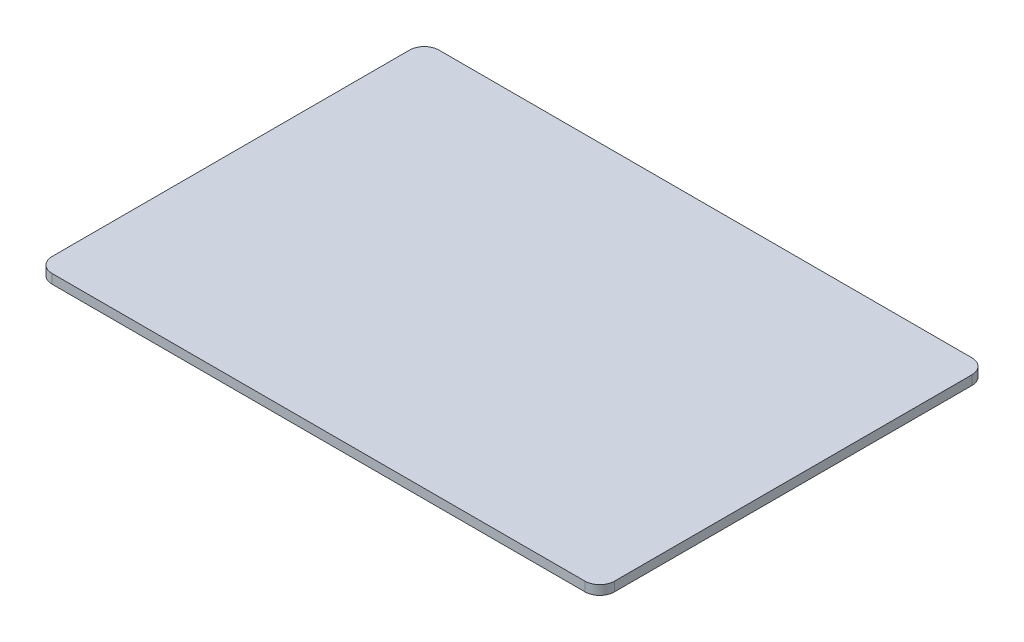
ISO-10303-21;
HEADER;
FILE_DESCRIPTION(('STEP AP214'),'2;1');
FILE_NAME('part.step','',(''),(''),'','','');
FILE_SCHEMA(('AUTOMOTIVE_DESIGN { 1 0 10303 214 1 1 1 1 }'));
ENDSEC;
DATA;
#1=APPLICATION_CONTEXT('core data for automotive mechanical design processes');
#2=APPLICATION_PROTOCOL_DEFINITION('international standard','automotive_design',2000,#1);
#3=PRODUCT_CONTEXT('',#1,'mechanical');
#4=PRODUCT('Part','Part','',(#3));
#5=PRODUCT_RELATED_PRODUCT_CATEGORY('part','',(#4));
#6=PRODUCT_DEFINITION_FORMATION('','',#4);
#7=PRODUCT_DEFINITION_CONTEXT('part definition',#1,'design');
#8=PRODUCT_DEFINITION('design','',#6,#7);
#9=PRODUCT_DEFINITION_SHAPE('','',#8);
#10=(LENGTH_UNIT() NAMED_UNIT(*) SI_UNIT(.MILLI.,.METRE.));
#11=(NAMED_UNIT(*) PLANE_ANGLE_UNIT() SI_UNIT($,.RADIAN.));
#12=(NAMED_UNIT(*) SI_UNIT($,.STERADIAN.) SOLID_ANGLE_UNIT());
#13=UNCERTAINTY_MEASURE_WITH_UNIT(LENGTH_MEASURE(1.E-05),#10,'distance_accuracy_value','');
#14=(GEOMETRIC_REPRESENTATION_CONTEXT(3) GLOBAL_UNCERTAINTY_ASSIGNED_CONTEXT((#13)) GLOBAL_UNIT_ASSIGNED_CONTEXT((#10,
#11,#12)) REPRESENTATION_CONTEXT('',''));
#15=CARTESIAN_POINT('',(0.,0.,0.));
#16=DIRECTION('',(0.,0.,1.));
#17=DIRECTION('',(1.,0.,0.));
#18=AXIS2_PLACEMENT_3D('',#15,#16,#17);
#19=CARTESIAN_POINT('',(-181.65,6.35,-121.85));
#20=DIRECTION('',(0.,-1.,0.));
#21=DIRECTION('',(0.,0.,-1.));
#22=AXIS2_PLACEMENT_3D('',#19,#20,#21);
#23=CYLINDRICAL_SURFACE('',#22,9.99999999999999);
#24=CARTESIAN_POINT('',(-181.65,0.,-121.85));
#25=DIRECTION('',(0.,1.,0.));
#26=DIRECTION('',(0.,0.,-1.));
#27=AXIS2_PLACEMENT_3D('',#24,#25,#26);
#28=CIRCLE('',#27,9.99999999999999);
#29=CARTESIAN_POINT('',(-181.65,0.,-131.85));
#30=VERTEX_POINT('',#29);
#31=CARTESIAN_POINT('',(-191.65,0.,-121.85));
#32=VERTEX_POINT('',#31);
#33=EDGE_CURVE('E129',#30,#32,#28,.T.);
#34=ORIENTED_EDGE('',*,*,#33,.T.);
#35=DIRECTION('',(0.,-1.,0.));
#36=VECTOR('',#35,1.);
#37=CARTESIAN_POINT('',(-191.65,6.35,-121.85));
#38=LINE('',#37,#36);
#39=CARTESIAN_POINT('',(-191.65,6.35,-121.85));
#40=VERTEX_POINT('',#39);
#41=EDGE_CURVE('E11',#40,#32,#38,.T.);
#42=ORIENTED_EDGE('',*,*,#41,.F.);
#43=CARTESIAN_POINT('',(-181.65,6.35,-121.85));
#44=DIRECTION('',(0.,1.,0.));
#45=DIRECTION('',(0.,0.,-1.));
#46=AXIS2_PLACEMENT_3D('',#43,#44,#45);
#47=CIRCLE('',#46,9.99999999999999);
#48=CARTESIAN_POINT('',(-181.65,6.35,-131.85));
#49=VERTEX_POINT('',#48);
#50=EDGE_CURVE('E143',#49,#40,#47,.T.);
#51=ORIENTED_EDGE('',*,*,#50,.F.);
#52=DIRECTION('',(0.,-1.,0.));
#53=VECTOR('',#52,1.);
#54=CARTESIAN_POINT('',(-181.65,6.35,-131.85));
#55=LINE('',#54,#53);
#56=EDGE_CURVE('E125',#49,#30,#55,.T.);
#57=ORIENTED_EDGE('',*,*,#56,.T.);
#58=EDGE_LOOP('',(#34,#42,#51,#57));
#59=FACE_BOUND('',#58,.T.);
#60=ADVANCED_FACE('F33',(#59),#23,.T.);
#61=CARTESIAN_POINT('',(-191.65,6.35,121.85));
#62=DIRECTION('',(1.,0.,0.));
#63=DIRECTION('',(0.,0.,-1.));
#64=AXIS2_PLACEMENT_3D('',#61,#62,#63);
#65=PLANE('',#64);
#66=DIRECTION('',(0.,0.,1.));
#67=VECTOR('',#66,1.);
#68=CARTESIAN_POINT('',(-191.65,0.,121.85));
#69=LINE('',#68,#67);
#70=CARTESIAN_POINT('',(-191.65,0.,121.85));
#71=VERTEX_POINT('',#70);
#72=EDGE_CURVE('E132',#32,#71,#69,.T.);
#73=ORIENTED_EDGE('',*,*,#72,.T.);
#74=DIRECTION('',(0.,-1.,0.));
#75=VECTOR('',#74,1.);
#76=CARTESIAN_POINT('',(-191.65,6.35,121.85));
#77=LINE('',#76,#75);
#78=CARTESIAN_POINT('',(-191.65,6.35,121.85));
#79=VERTEX_POINT('',#78);
#80=EDGE_CURVE('E41',#79,#71,#77,.T.);
#81=ORIENTED_EDGE('',*,*,#80,.F.);
#82=DIRECTION('',(0.,0.,1.));
#83=VECTOR('',#82,1.);
#84=CARTESIAN_POINT('',(-191.65,6.35,121.85));
#85=LINE('',#84,#83);
#86=EDGE_CURVE('E92',#40,#79,#85,.T.);
#87=ORIENTED_EDGE('',*,*,#86,.F.);
#88=ORIENTED_EDGE('',*,*,#41,.T.);
#89=EDGE_LOOP('',(#73,#81,#87,#88));
#90=FACE_BOUND('',#89,.T.);
#91=ADVANCED_FACE('F178',(#90),#65,.F.);
#92=CARTESIAN_POINT('',(-181.65,6.35,121.85));
#93=DIRECTION('',(0.,-1.,0.));
#94=DIRECTION('',(0.,0.,-1.));
#95=AXIS2_PLACEMENT_3D('',#92,#93,#94);
#96=CYLINDRICAL_SURFACE('',#95,10.);
#97=CARTESIAN_POINT('',(-181.65,0.,121.85));
#98=DIRECTION('',(0.,1.,0.));
#99=DIRECTION('',(0.,0.,-1.));
#100=AXIS2_PLACEMENT_3D('',#97,#98,#99);
#101=CIRCLE('',#100,10.);
#102=CARTESIAN_POINT('',(-181.65,0.,131.85));
#103=VERTEX_POINT('',#102);
#104=EDGE_CURVE('E134',#71,#103,#101,.T.);
#105=ORIENTED_EDGE('',*,*,#104,.T.);
#106=DIRECTION('',(0.,-1.,0.));
#107=VECTOR('',#106,1.);
#108=CARTESIAN_POINT('',(-181.65,6.35,131.85));
#109=LINE('',#108,#107);
#110=CARTESIAN_POINT('',(-181.65,6.35,131.85));
#111=VERTEX_POINT('',#110);
#112=EDGE_CURVE('E150',#111,#103,#109,.T.);
#113=ORIENTED_EDGE('',*,*,#112,.F.);
#114=CARTESIAN_POINT('',(-181.65,6.35,121.85));
#115=DIRECTION('',(0.,1.,0.));
#116=DIRECTION('',(0.,0.,-1.));
#117=AXIS2_PLACEMENT_3D('',#114,#115,#116);
#118=CIRCLE('',#117,10.);
#119=EDGE_CURVE('E158',#79,#111,#118,.T.);
#120=ORIENTED_EDGE('',*,*,#119,.F.);
#121=ORIENTED_EDGE('',*,*,#80,.T.);
#122=EDGE_LOOP('',(#105,#113,#120,#121));
#123=FACE_BOUND('',#122,.T.);
#124=ADVANCED_FACE('F156',(#123),#96,.T.);
#125=CARTESIAN_POINT('',(-181.65,6.35,131.85));
#126=DIRECTION('',(0.,0.,-1.));
#127=DIRECTION('',(-1.,0.,0.));
#128=AXIS2_PLACEMENT_3D('',#125,#126,#127);
#129=PLANE('',#128);
#130=DIRECTION('',(1.,0.,0.));
#131=VECTOR('',#130,1.);
#132=CARTESIAN_POINT('',(-181.65,0.,131.85));
#133=LINE('',#132,#131);
#134=CARTESIAN_POINT('',(181.65,0.,131.85));
#135=VERTEX_POINT('',#134);
#136=EDGE_CURVE('E136',#103,#135,#133,.T.);
#137=ORIENTED_EDGE('',*,*,#136,.T.);
#138=DIRECTION('',(0.,-1.,0.));
#139=VECTOR('',#138,1.);
#140=CARTESIAN_POINT('',(181.65,6.35,131.85));
#141=LINE('',#140,#139);
#142=CARTESIAN_POINT('',(181.65,6.35,131.85));
#143=VERTEX_POINT('',#142);
#144=EDGE_CURVE('E147',#143,#135,#141,.T.);
#145=ORIENTED_EDGE('',*,*,#144,.F.);
#146=DIRECTION('',(1.,0.,0.));
#147=VECTOR('',#146,1.);
#148=CARTESIAN_POINT('',(-181.65,6.35,131.85));
#149=LINE('',#148,#147);
#150=EDGE_CURVE('E170',#111,#143,#149,.T.);
#151=ORIENTED_EDGE('',*,*,#150,.F.);
#152=ORIENTED_EDGE('',*,*,#112,.T.);
#153=EDGE_LOOP('',(#137,#145,#151,#152));
#154=FACE_BOUND('',#153,.T.);
#155=ADVANCED_FACE('F166',(#154),#129,.F.);
#156=CARTESIAN_POINT('',(181.65,6.35,121.85));
#157=DIRECTION('',(0.,-1.,0.));
#158=DIRECTION('',(0.,0.,-1.));
#159=AXIS2_PLACEMENT_3D('',#156,#157,#158);
#160=CYLINDRICAL_SURFACE('',#159,10.);
#161=CARTESIAN_POINT('',(181.65,0.,121.85));
#162=DIRECTION('',(0.,1.,0.));
#163=DIRECTION('',(0.,0.,-1.));
#164=AXIS2_PLACEMENT_3D('',#161,#162,#163);
#165=CIRCLE('',#164,10.);
#166=CARTESIAN_POINT('',(191.65,0.,121.85));
#167=VERTEX_POINT('',#166);
#168=EDGE_CURVE('E138',#135,#167,#165,.T.);
#169=ORIENTED_EDGE('',*,*,#168,.T.);
#170=DIRECTION('',(0.,-1.,0.));
#171=VECTOR('',#170,1.);
#172=CARTESIAN_POINT('',(191.65,6.35,121.85));
#173=LINE('',#172,#171);
#174=CARTESIAN_POINT('',(191.65,6.35,121.85));
#175=VERTEX_POINT('',#174);
#176=EDGE_CURVE('E120',#175,#167,#173,.T.);
#177=ORIENTED_EDGE('',*,*,#176,.F.);
#178=CARTESIAN_POINT('',(181.65,6.35,121.85));
#179=DIRECTION('',(0.,1.,0.));
#180=DIRECTION('',(0.,0.,-1.));
#181=AXIS2_PLACEMENT_3D('',#178,#179,#180);
#182=CIRCLE('',#181,10.);
#183=EDGE_CURVE('E111',#143,#175,#182,.T.);
#184=ORIENTED_EDGE('',*,*,#183,.F.);
#185=ORIENTED_EDGE('',*,*,#144,.T.);
#186=EDGE_LOOP('',(#169,#177,#184,#185));
#187=FACE_BOUND('',#186,.T.);
#188=ADVANCED_FACE('F169',(#187),#160,.T.);
#189=CARTESIAN_POINT('',(191.65,6.35,121.85));
#190=DIRECTION('',(-1.,0.,0.));
#191=DIRECTION('',(0.,0.,1.));
#192=AXIS2_PLACEMENT_3D('',#189,#190,#191);
#193=PLANE('',#192);
#194=DIRECTION('',(0.,0.,-1.));
#195=VECTOR('',#194,1.);
#196=CARTESIAN_POINT('',(191.65,0.,121.85));
#197=LINE('',#196,#195);
#198=CARTESIAN_POINT('',(191.65,0.,-121.85));
#199=VERTEX_POINT('',#198);
#200=EDGE_CURVE('E119',#167,#199,#197,.T.);
#201=ORIENTED_EDGE('',*,*,#200,.T.);
#202=DIRECTION('',(0.,-1.,0.));
#203=VECTOR('',#202,1.);
#204=CARTESIAN_POINT('',(191.65,6.35,-121.85));
#205=LINE('',#204,#203);
#206=CARTESIAN_POINT('',(191.65,6.35,-121.85));
#207=VERTEX_POINT('',#206);
#208=EDGE_CURVE('E116',#207,#199,#205,.T.);
#209=ORIENTED_EDGE('',*,*,#208,.F.);
#210=DIRECTION('',(0.,0.,-1.));
#211=VECTOR('',#210,1.);
#212=CARTESIAN_POINT('',(191.65,6.35,121.85));
#213=LINE('',#212,#211);
#214=EDGE_CURVE('E105',#175,#207,#213,.T.);
#215=ORIENTED_EDGE('',*,*,#214,.F.);
#216=ORIENTED_EDGE('',*,*,#176,.T.);
#217=EDGE_LOOP('',(#201,#209,#215,#216));
#218=FACE_BOUND('',#217,.T.);
#219=ADVANCED_FACE('F117',(#218),#193,.F.);
#220=CARTESIAN_POINT('',(181.65,6.35,-121.85));
#221=DIRECTION('',(0.,-1.,0.));
#222=DIRECTION('',(0.,0.,-1.));
#223=AXIS2_PLACEMENT_3D('',#220,#221,#222);
#224=CYLINDRICAL_SURFACE('',#223,9.99999999999999);
#225=CARTESIAN_POINT('',(181.65,0.,-121.85));
#226=DIRECTION('',(0.,1.,0.));
#227=DIRECTION('',(0.,0.,-1.));
#228=AXIS2_PLACEMENT_3D('',#225,#226,#227);
#229=CIRCLE('',#228,9.99999999999999);
#230=CARTESIAN_POINT('',(181.65,0.,-131.85));
#231=VERTEX_POINT('',#230);
#232=EDGE_CURVE('E78',#199,#231,#229,.T.);
#233=ORIENTED_EDGE('',*,*,#232,.T.);
#234=DIRECTION('',(0.,-1.,0.));
#235=VECTOR('',#234,1.);
#236=CARTESIAN_POINT('',(181.65,6.35,-131.85));
#237=LINE('',#236,#235);
#238=CARTESIAN_POINT('',(181.65,6.35,-131.85));
#239=VERTEX_POINT('',#238);
#240=EDGE_CURVE('E121',#239,#231,#237,.T.);
#241=ORIENTED_EDGE('',*,*,#240,.F.);
#242=CARTESIAN_POINT('',(181.65,6.35,-121.85));
#243=DIRECTION('',(0.,1.,0.));
#244=DIRECTION('',(0.,0.,-1.));
#245=AXIS2_PLACEMENT_3D('',#242,#243,#244);
#246=CIRCLE('',#245,9.99999999999999);
#247=EDGE_CURVE('E109',#207,#239,#246,.T.);
#248=ORIENTED_EDGE('',*,*,#247,.F.);
#249=ORIENTED_EDGE('',*,*,#208,.T.);
#250=EDGE_LOOP('',(#233,#241,#248,#249));
#251=FACE_BOUND('',#250,.T.);
#252=ADVANCED_FACE('F123',(#251),#224,.T.);
#253=CARTESIAN_POINT('',(-181.65,6.35,-131.85));
#254=DIRECTION('',(0.,0.,1.));
#255=DIRECTION('',(1.,0.,0.));
#256=AXIS2_PLACEMENT_3D('',#253,#254,#255);
#257=PLANE('',#256);
#258=DIRECTION('',(-1.,0.,0.));
#259=VECTOR('',#258,1.);
#260=CARTESIAN_POINT('',(-181.65,0.,-131.85));
#261=LINE('',#260,#259);
#262=EDGE_CURVE('E84',#231,#30,#261,.T.);
#263=ORIENTED_EDGE('',*,*,#262,.T.);
#264=ORIENTED_EDGE('',*,*,#56,.F.);
#265=DIRECTION('',(-1.,0.,0.));
#266=VECTOR('',#265,1.);
#267=CARTESIAN_POINT('',(-181.65,6.35,-131.85));
#268=LINE('',#267,#266);
#269=EDGE_CURVE('E49',#239,#49,#268,.T.);
#270=ORIENTED_EDGE('',*,*,#269,.F.);
#271=ORIENTED_EDGE('',*,*,#240,.T.);
#272=EDGE_LOOP('',(#263,#264,#270,#271));
#273=FACE_BOUND('',#272,.T.);
#274=ADVANCED_FACE('F194',(#273),#257,.F.);
#275=CARTESIAN_POINT('',(-181.65,6.35,-121.85));
#276=DIRECTION('',(0.,-1.,0.));
#277=DIRECTION('',(0.,0.,-1.));
#278=AXIS2_PLACEMENT_3D('',#275,#276,#277);
#279=PLANE('',#278);
#280=ORIENTED_EDGE('',*,*,#50,.T.);
#281=ORIENTED_EDGE('',*,*,#86,.T.);
#282=ORIENTED_EDGE('',*,*,#119,.T.);
#283=ORIENTED_EDGE('',*,*,#150,.T.);
#284=ORIENTED_EDGE('',*,*,#183,.T.);
#285=ORIENTED_EDGE('',*,*,#214,.T.);
#286=ORIENTED_EDGE('',*,*,#247,.T.);
#287=ORIENTED_EDGE('',*,*,#269,.T.);
#288=EDGE_LOOP('',(#280,#281,#282,#283,#284,#285,#286,#287));
#289=FACE_BOUND('',#288,.T.);
#290=ADVANCED_FACE('F107',(#289),#279,.F.);
#291=CARTESIAN_POINT('',(-181.65,0.,-121.85));
#292=DIRECTION('',(0.,-1.,0.));
#293=DIRECTION('',(0.,0.,-1.));
#294=AXIS2_PLACEMENT_3D('',#291,#292,#293);
#295=PLANE('',#294);
#296=ORIENTED_EDGE('',*,*,#33,.F.);
#297=ORIENTED_EDGE('',*,*,#262,.F.);
#298=ORIENTED_EDGE('',*,*,#232,.F.);
#299=ORIENTED_EDGE('',*,*,#200,.F.);
#300=ORIENTED_EDGE('',*,*,#168,.F.);
#301=ORIENTED_EDGE('',*,*,#136,.F.);
#302=ORIENTED_EDGE('',*,*,#104,.F.);
#303=ORIENTED_EDGE('',*,*,#72,.F.);
#304=EDGE_LOOP('',(#296,#297,#298,#299,#300,#301,#302,#303));
#305=FACE_BOUND('',#304,.T.);
#306=ADVANCED_FACE('F162',(#305),#295,.T.);
#307=CLOSED_SHELL('',(#60,#91,#124,#155,#188,#219,#252,#274,#290,#306));
#308=MANIFOLD_SOLID_BREP('B2',#307);
#309=ADVANCED_BREP_SHAPE_REPRESENTATION('',(#18,#308),#14);
#310=SHAPE_DEFINITION_REPRESENTATION(#9,#309);
ENDSEC;
END-ISO-10303-21;
